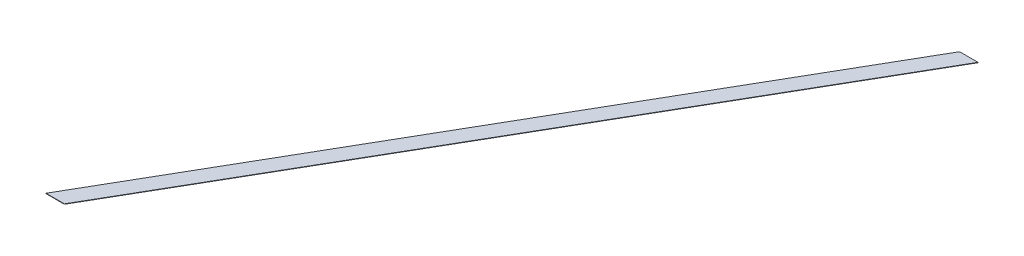
ISO-10303-21;
HEADER;
FILE_DESCRIPTION(('STEP AP214'),'2;1');
FILE_NAME('part.step','',(''),(''),'','','');
FILE_SCHEMA(('AUTOMOTIVE_DESIGN { 1 0 10303 214 1 1 1 1 }'));
ENDSEC;
DATA;
#1=APPLICATION_CONTEXT('core data for automotive mechanical design processes');
#2=APPLICATION_PROTOCOL_DEFINITION('international standard','automotive_design',2000,#1);
#3=PRODUCT_CONTEXT('',#1,'mechanical');
#4=PRODUCT('Part','Part','',(#3));
#5=PRODUCT_RELATED_PRODUCT_CATEGORY('part','',(#4));
#6=PRODUCT_DEFINITION_FORMATION('','',#4);
#7=PRODUCT_DEFINITION_CONTEXT('part definition',#1,'design');
#8=PRODUCT_DEFINITION('design','',#6,#7);
#9=PRODUCT_DEFINITION_SHAPE('','',#8);
#10=(LENGTH_UNIT() NAMED_UNIT(*) SI_UNIT(.MILLI.,.METRE.));
#11=(NAMED_UNIT(*) PLANE_ANGLE_UNIT() SI_UNIT($,.RADIAN.));
#12=(NAMED_UNIT(*) SI_UNIT($,.STERADIAN.) SOLID_ANGLE_UNIT());
#13=UNCERTAINTY_MEASURE_WITH_UNIT(LENGTH_MEASURE(1.E-05),#10,'distance_accuracy_value','');
#14=(GEOMETRIC_REPRESENTATION_CONTEXT(3) GLOBAL_UNCERTAINTY_ASSIGNED_CONTEXT((#13)) GLOBAL_UNIT_ASSIGNED_CONTEXT((#10,
#11,#12)) REPRESENTATION_CONTEXT('',''));
#15=CARTESIAN_POINT('',(0.,0.,0.));
#16=DIRECTION('',(0.,0.,1.));
#17=DIRECTION('',(1.,0.,0.));
#18=AXIS2_PLACEMENT_3D('',#15,#16,#17);
#19=CARTESIAN_POINT('',(-44.0029541043966,1.27,-25.3846416182384));
#20=DIRECTION('',(-0.866199883944809,0.,-0.499697669650359));
#21=DIRECTION('',(-0.499697669650359,0.,0.866199883944809));
#22=AXIS2_PLACEMENT_3D('',#19,#20,#21);
#23=PLANE('',#22);
#24=DIRECTION('',(0.499697669650359,0.,-0.866199883944809));
#25=VECTOR('',#24,1.);
#26=CARTESIAN_POINT('',(-44.0029541043966,0.,-25.3846416182384));
#27=LINE('',#26,#25);
#28=CARTESIAN_POINT('',(456.737314738187,0.,-893.39181695974));
#29=VERTEX_POINT('',#28);
#30=CARTESIAN_POINT('',(1523.07849709429,0.,-2741.83871695974));
#31=VERTEX_POINT('',#30);
#32=EDGE_CURVE('E98',#29,#31,#27,.T.);
#33=ORIENTED_EDGE('',*,*,#32,.F.);
#34=DIRECTION('',(0.,-1.,0.));
#35=VECTOR('',#34,1.);
#36=CARTESIAN_POINT('',(456.737314738187,1.27,-893.39181695974));
#37=LINE('',#36,#35);
#38=CARTESIAN_POINT('',(456.737314738187,1.27,-893.39181695974));
#39=VERTEX_POINT('',#38);
#40=EDGE_CURVE('E11',#39,#29,#37,.T.);
#41=ORIENTED_EDGE('',*,*,#40,.F.);
#42=DIRECTION('',(0.499697669650359,0.,-0.866199883944809));
#43=VECTOR('',#42,1.);
#44=CARTESIAN_POINT('',(-44.0029541043966,1.27,-25.3846416182384));
#45=LINE('',#44,#43);
#46=CARTESIAN_POINT('',(1523.07849709429,1.27,-2741.83871695974));
#47=VERTEX_POINT('',#46);
#48=EDGE_CURVE('E83',#39,#47,#45,.T.);
#49=ORIENTED_EDGE('',*,*,#48,.T.);
#50=DIRECTION('',(0.,-1.,0.));
#51=VECTOR('',#50,1.);
#52=CARTESIAN_POINT('',(1523.07849709429,1.27,-2741.83871695974));
#53=LINE('',#52,#51);
#54=EDGE_CURVE('E51',#47,#31,#53,.T.);
#55=ORIENTED_EDGE('',*,*,#54,.T.);
#56=EDGE_LOOP('',(#33,#41,#49,#55));
#57=FACE_BOUND('',#56,.T.);
#58=ADVANCED_FACE('F35',(#57),#23,.T.);
#59=CARTESIAN_POINT('',(0.,1.27,-893.39181695974));
#60=DIRECTION('',(0.,0.,-1.));
#61=DIRECTION('',(-1.,0.,0.));
#62=AXIS2_PLACEMENT_3D('',#59,#60,#61);
#63=PLANE('',#62);
#64=DIRECTION('',(1.,0.,0.));
#65=VECTOR('',#64,1.);
#66=CARTESIAN_POINT('',(0.,0.,-893.39181695974));
#67=LINE('',#66,#65);
#68=CARTESIAN_POINT('',(515.384286345536,0.,-893.39181695974));
#69=VERTEX_POINT('',#68);
#70=EDGE_CURVE('E89',#29,#69,#67,.T.);
#71=ORIENTED_EDGE('',*,*,#70,.T.);
#72=DIRECTION('',(0.,-1.,0.));
#73=VECTOR('',#72,1.);
#74=CARTESIAN_POINT('',(515.384286345536,1.27,-893.39181695974));
#75=LINE('',#74,#73);
#76=CARTESIAN_POINT('',(515.384286345536,1.27,-893.39181695974));
#77=VERTEX_POINT('',#76);
#78=EDGE_CURVE('E43',#77,#69,#75,.T.);
#79=ORIENTED_EDGE('',*,*,#78,.F.);
#80=DIRECTION('',(1.,0.,0.));
#81=VECTOR('',#80,1.);
#82=CARTESIAN_POINT('',(0.,1.27,-893.39181695974));
#83=LINE('',#82,#81);
#84=EDGE_CURVE('E77',#39,#77,#83,.T.);
#85=ORIENTED_EDGE('',*,*,#84,.F.);
#86=ORIENTED_EDGE('',*,*,#40,.T.);
#87=EDGE_LOOP('',(#71,#79,#85,#86));
#88=FACE_BOUND('',#87,.T.);
#89=ADVANCED_FACE('F87',(#88),#63,.F.);
#90=CARTESIAN_POINT('',(0.,1.27,0.));
#91=DIRECTION('',(0.866199883944809,0.,0.499697669650359));
#92=DIRECTION('',(0.499697669650359,0.,-0.866199883944809));
#93=AXIS2_PLACEMENT_3D('',#90,#91,#92);
#94=PLANE('',#93);
#95=DIRECTION('',(-0.499697669650359,0.,0.866199883944809));
#96=VECTOR('',#95,1.);
#97=CARTESIAN_POINT('',(0.,0.,0.));
#98=LINE('',#97,#96);
#99=CARTESIAN_POINT('',(1581.72546870164,0.,-2741.83871695974));
#100=VERTEX_POINT('',#99);
#101=EDGE_CURVE('E101',#100,#69,#98,.T.);
#102=ORIENTED_EDGE('',*,*,#101,.F.);
#103=DIRECTION('',(0.,-1.,0.));
#104=VECTOR('',#103,1.);
#105=CARTESIAN_POINT('',(1581.72546870164,1.27,-2741.83871695974));
#106=LINE('',#105,#104);
#107=CARTESIAN_POINT('',(1581.72546870164,1.27,-2741.83871695974));
#108=VERTEX_POINT('',#107);
#109=EDGE_CURVE('E64',#108,#100,#106,.T.);
#110=ORIENTED_EDGE('',*,*,#109,.F.);
#111=DIRECTION('',(-0.499697669650359,0.,0.866199883944809));
#112=VECTOR('',#111,1.);
#113=CARTESIAN_POINT('',(0.,1.27,0.));
#114=LINE('',#113,#112);
#115=EDGE_CURVE('E82',#108,#77,#114,.T.);
#116=ORIENTED_EDGE('',*,*,#115,.T.);
#117=ORIENTED_EDGE('',*,*,#78,.T.);
#118=EDGE_LOOP('',(#102,#110,#116,#117));
#119=FACE_BOUND('',#118,.T.);
#120=ADVANCED_FACE('F92',(#119),#94,.T.);
#121=CARTESIAN_POINT('',(0.,1.27,-2741.83871695974));
#122=DIRECTION('',(0.,0.,-1.));
#123=DIRECTION('',(-1.,0.,0.));
#124=AXIS2_PLACEMENT_3D('',#121,#122,#123);
#125=PLANE('',#124);
#126=DIRECTION('',(1.,0.,0.));
#127=VECTOR('',#126,1.);
#128=CARTESIAN_POINT('',(0.,0.,-2741.83871695974));
#129=LINE('',#128,#127);
#130=EDGE_CURVE('E103',#31,#100,#129,.T.);
#131=ORIENTED_EDGE('',*,*,#130,.F.);
#132=ORIENTED_EDGE('',*,*,#54,.F.);
#133=DIRECTION('',(1.,0.,0.));
#134=VECTOR('',#133,1.);
#135=CARTESIAN_POINT('',(0.,1.27,-2741.83871695974));
#136=LINE('',#135,#134);
#137=EDGE_CURVE('E93',#47,#108,#136,.T.);
#138=ORIENTED_EDGE('',*,*,#137,.T.);
#139=ORIENTED_EDGE('',*,*,#109,.T.);
#140=EDGE_LOOP('',(#131,#132,#138,#139));
#141=FACE_BOUND('',#140,.T.);
#142=ADVANCED_FACE('F108',(#141),#125,.T.);
#143=CARTESIAN_POINT('',(0.,1.27,0.));
#144=DIRECTION('',(0.,1.,0.));
#145=DIRECTION('',(0.,0.,1.));
#146=AXIS2_PLACEMENT_3D('',#143,#144,#145);
#147=PLANE('',#146);
#148=ORIENTED_EDGE('',*,*,#48,.F.);
#149=ORIENTED_EDGE('',*,*,#84,.T.);
#150=ORIENTED_EDGE('',*,*,#115,.F.);
#151=ORIENTED_EDGE('',*,*,#137,.F.);
#152=EDGE_LOOP('',(#148,#149,#150,#151));
#153=FACE_BOUND('',#152,.T.);
#154=ADVANCED_FACE('F79',(#153),#147,.T.);
#155=CARTESIAN_POINT('',(0.,0.,0.));
#156=DIRECTION('',(0.,1.,0.));
#157=DIRECTION('',(0.,0.,1.));
#158=AXIS2_PLACEMENT_3D('',#155,#156,#157);
#159=PLANE('',#158);
#160=ORIENTED_EDGE('',*,*,#32,.T.);
#161=ORIENTED_EDGE('',*,*,#130,.T.);
#162=ORIENTED_EDGE('',*,*,#101,.T.);
#163=ORIENTED_EDGE('',*,*,#70,.F.);
#164=EDGE_LOOP('',(#160,#161,#162,#163));
#165=FACE_BOUND('',#164,.T.);
#166=ADVANCED_FACE('F115',(#165),#159,.F.);
#167=CLOSED_SHELL('',(#58,#89,#120,#142,#154,#166));
#168=MANIFOLD_SOLID_BREP('B2',#167);
#169=ADVANCED_BREP_SHAPE_REPRESENTATION('',(#18,#168),#14);
#170=SHAPE_DEFINITION_REPRESENTATION(#9,#169);
ENDSEC;
END-ISO-10303-21;
